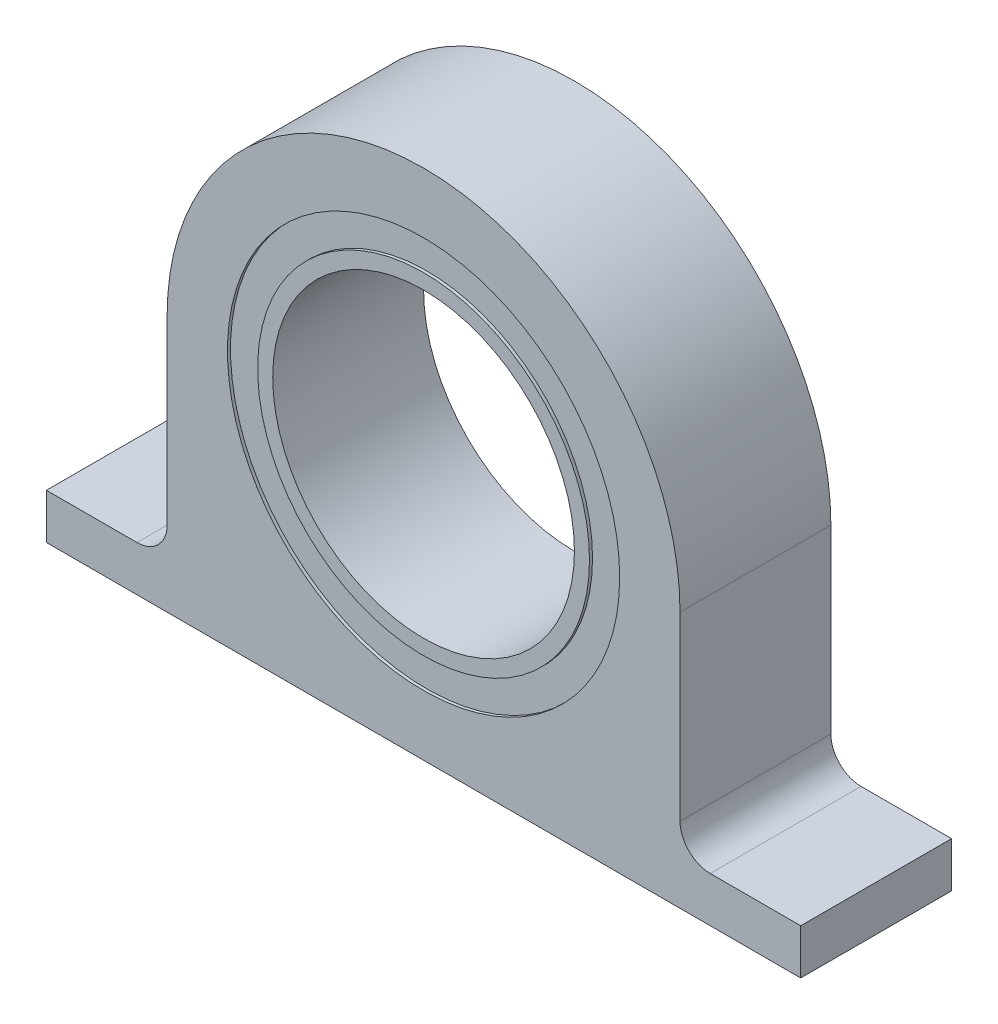
ISO-10303-21;
HEADER;
FILE_DESCRIPTION(('STEP AP214'),'2;1');
FILE_NAME('part.step','',(''),(''),'','','');
FILE_SCHEMA(('AUTOMOTIVE_DESIGN { 1 0 10303 214 1 1 1 1 }'));
ENDSEC;
DATA;
#1=APPLICATION_CONTEXT('core data for automotive mechanical design processes');
#2=APPLICATION_PROTOCOL_DEFINITION('international standard','automotive_design',2000,#1);
#3=PRODUCT_CONTEXT('',#1,'mechanical');
#4=PRODUCT('Part','Part','',(#3));
#5=PRODUCT_RELATED_PRODUCT_CATEGORY('part','',(#4));
#6=PRODUCT_DEFINITION_FORMATION('','',#4);
#7=PRODUCT_DEFINITION_CONTEXT('part definition',#1,'design');
#8=PRODUCT_DEFINITION('design','',#6,#7);
#9=PRODUCT_DEFINITION_SHAPE('','',#8);
#10=(LENGTH_UNIT() NAMED_UNIT(*) SI_UNIT(.MILLI.,.METRE.));
#11=(NAMED_UNIT(*) PLANE_ANGLE_UNIT() SI_UNIT($,.RADIAN.));
#12=(NAMED_UNIT(*) SI_UNIT($,.STERADIAN.) SOLID_ANGLE_UNIT());
#13=UNCERTAINTY_MEASURE_WITH_UNIT(LENGTH_MEASURE(1.E-05),#10,'distance_accuracy_value','');
#14=(GEOMETRIC_REPRESENTATION_CONTEXT(3) GLOBAL_UNCERTAINTY_ASSIGNED_CONTEXT((#13)) GLOBAL_UNIT_ASSIGNED_CONTEXT((#10,
#11,#12)) REPRESENTATION_CONTEXT('',''));
#15=CARTESIAN_POINT('',(0.,0.,0.));
#16=DIRECTION('',(0.,0.,1.));
#17=DIRECTION('',(1.,0.,0.));
#18=AXIS2_PLACEMENT_3D('',#15,#16,#17);
#19=CARTESIAN_POINT('',(0.,0.,0.));
#20=DIRECTION('',(0.,0.,1.));
#21=DIRECTION('',(1.,0.,0.));
#22=AXIS2_PLACEMENT_3D('',#19,#20,#21);
#23=PLANE('',#22);
#24=CARTESIAN_POINT('',(0.,0.,0.));
#25=DIRECTION('',(0.,0.,1.));
#26=DIRECTION('',(1.,0.,0.));
#27=AXIS2_PLACEMENT_3D('',#24,#25,#26);
#28=CIRCLE('',#27,12.7);
#29=CARTESIAN_POINT('',(12.7,0.,0.));
#30=VERTEX_POINT('',#29);
#31=EDGE_CURVE('E39',#30,#30,#28,.T.);
#32=ORIENTED_EDGE('',*,*,#31,.T.);
#33=EDGE_LOOP('',(#32));
#34=FACE_BOUND('',#33,.T.);
#35=CARTESIAN_POINT('',(0.,0.,0.));
#36=DIRECTION('',(0.,0.,1.));
#37=DIRECTION('',(1.,0.,0.));
#38=AXIS2_PLACEMENT_3D('',#35,#36,#37);
#39=CIRCLE('',#38,13.97);
#40=CARTESIAN_POINT('',(13.97,0.,0.));
#41=VERTEX_POINT('',#40);
#42=EDGE_CURVE('E196',#41,#41,#39,.T.);
#43=ORIENTED_EDGE('',*,*,#42,.F.);
#44=EDGE_LOOP('',(#43));
#45=FACE_BOUND('',#44,.T.);
#46=ADVANCED_FACE('F35',(#34,#45),#23,.F.);
#47=CARTESIAN_POINT('',(0.,0.,12.7));
#48=DIRECTION('',(0.,0.,1.));
#49=DIRECTION('',(1.,0.,0.));
#50=AXIS2_PLACEMENT_3D('',#47,#48,#49);
#51=PLANE('',#50);
#52=CARTESIAN_POINT('',(0.,0.,12.7));
#53=DIRECTION('',(0.,0.,1.));
#54=DIRECTION('',(1.,0.,0.));
#55=AXIS2_PLACEMENT_3D('',#52,#53,#54);
#56=CIRCLE('',#55,12.7);
#57=CARTESIAN_POINT('',(12.7,0.,12.7));
#58=VERTEX_POINT('',#57);
#59=EDGE_CURVE('E11',#58,#58,#56,.T.);
#60=ORIENTED_EDGE('',*,*,#59,.F.);
#61=EDGE_LOOP('',(#60));
#62=FACE_BOUND('',#61,.T.);
#63=CARTESIAN_POINT('',(0.,0.,12.7));
#64=DIRECTION('',(0.,0.,1.));
#65=DIRECTION('',(1.,0.,0.));
#66=AXIS2_PLACEMENT_3D('',#63,#64,#65);
#67=CIRCLE('',#66,13.97);
#68=CARTESIAN_POINT('',(13.97,0.,12.7));
#69=VERTEX_POINT('',#68);
#70=EDGE_CURVE('E204',#69,#69,#67,.T.);
#71=ORIENTED_EDGE('',*,*,#70,.T.);
#72=EDGE_LOOP('',(#71));
#73=FACE_BOUND('',#72,.T.);
#74=ADVANCED_FACE('F224',(#62,#73),#51,.T.);
#75=CARTESIAN_POINT('',(0.,0.,12.7));
#76=DIRECTION('',(0.,0.,1.));
#77=DIRECTION('',(1.,0.,0.));
#78=AXIS2_PLACEMENT_3D('',#75,#76,#77);
#79=CIRCLE('',#78,16.51);
#80=CARTESIAN_POINT('',(16.51,0.,12.7));
#81=VERTEX_POINT('',#80);
#82=EDGE_CURVE('E213',#81,#81,#79,.T.);
#83=ORIENTED_EDGE('',*,*,#82,.F.);
#84=EDGE_LOOP('',(#83));
#85=FACE_BOUND('',#84,.T.);
#86=DIRECTION('',(-1.,0.,0.));
#87=VECTOR('',#86,1.);
#88=CARTESIAN_POINT('',(-31.75,-17.78,12.7));
#89=LINE('',#88,#87);
#90=CARTESIAN_POINT('',(-24.13,-17.78,12.7));
#91=VERTEX_POINT('',#90);
#92=CARTESIAN_POINT('',(-31.75,-17.78,12.7));
#93=VERTEX_POINT('',#92);
#94=EDGE_CURVE('E116',#91,#93,#89,.T.);
#95=ORIENTED_EDGE('',*,*,#94,.T.);
#96=DIRECTION('',(0.,-1.,0.));
#97=VECTOR('',#96,1.);
#98=CARTESIAN_POINT('',(-31.75,-17.78,12.7));
#99=LINE('',#98,#97);
#100=CARTESIAN_POINT('',(-31.75,-21.59,12.7));
#101=VERTEX_POINT('',#100);
#102=EDGE_CURVE('E125',#93,#101,#99,.T.);
#103=ORIENTED_EDGE('',*,*,#102,.T.);
#104=DIRECTION('',(1.,0.,0.));
#105=VECTOR('',#104,1.);
#106=CARTESIAN_POINT('',(-31.75,-21.59,12.7));
#107=LINE('',#106,#105);
#108=CARTESIAN_POINT('',(31.75,-21.59,12.7));
#109=VERTEX_POINT('',#108);
#110=EDGE_CURVE('E58',#101,#109,#107,.T.);
#111=ORIENTED_EDGE('',*,*,#110,.T.);
#112=DIRECTION('',(0.,1.,0.));
#113=VECTOR('',#112,1.);
#114=CARTESIAN_POINT('',(31.75,-17.78,12.7));
#115=LINE('',#114,#113);
#116=CARTESIAN_POINT('',(31.75,-17.78,12.7));
#117=VERTEX_POINT('',#116);
#118=EDGE_CURVE('E151',#109,#117,#115,.T.);
#119=ORIENTED_EDGE('',*,*,#118,.T.);
#120=DIRECTION('',(-1.,0.,0.));
#121=VECTOR('',#120,1.);
#122=CARTESIAN_POINT('',(24.13,-17.78,12.7));
#123=LINE('',#122,#121);
#124=CARTESIAN_POINT('',(24.13,-17.78,12.7));
#125=VERTEX_POINT('',#124);
#126=EDGE_CURVE('E148',#117,#125,#123,.T.);
#127=ORIENTED_EDGE('',*,*,#126,.T.);
#128=CARTESIAN_POINT('',(24.13,-15.24,12.7));
#129=DIRECTION('',(0.,0.,1.));
#130=DIRECTION('',(1.,0.,0.));
#131=AXIS2_PLACEMENT_3D('',#128,#129,#130);
#132=CIRCLE('',#131,2.54);
#133=CARTESIAN_POINT('',(21.59,-15.24,12.7));
#134=VERTEX_POINT('',#133);
#135=EDGE_CURVE('E145',#125,#134,#132,.F.);
#136=ORIENTED_EDGE('',*,*,#135,.T.);
#137=DIRECTION('',(0.,1.,0.));
#138=VECTOR('',#137,1.);
#139=CARTESIAN_POINT('',(21.59,-15.24,12.7));
#140=LINE('',#139,#138);
#141=CARTESIAN_POINT('',(21.59,0.,12.7));
#142=VERTEX_POINT('',#141);
#143=EDGE_CURVE('E142',#134,#142,#140,.T.);
#144=ORIENTED_EDGE('',*,*,#143,.T.);
#145=CARTESIAN_POINT('',(0.,0.,12.7));
#146=DIRECTION('',(0.,0.,1.));
#147=DIRECTION('',(1.,0.,0.));
#148=AXIS2_PLACEMENT_3D('',#145,#146,#147);
#149=CIRCLE('',#148,21.59);
#150=CARTESIAN_POINT('',(-21.59,0.,12.7));
#151=VERTEX_POINT('',#150);
#152=EDGE_CURVE('E139',#142,#151,#149,.T.);
#153=ORIENTED_EDGE('',*,*,#152,.T.);
#154=DIRECTION('',(0.,-1.,0.));
#155=VECTOR('',#154,1.);
#156=CARTESIAN_POINT('',(-21.59,0.,12.7));
#157=LINE('',#156,#155);
#158=CARTESIAN_POINT('',(-21.59,-15.24,12.7));
#159=VERTEX_POINT('',#158);
#160=EDGE_CURVE('E135',#151,#159,#157,.T.);
#161=ORIENTED_EDGE('',*,*,#160,.T.);
#162=CARTESIAN_POINT('',(-24.13,-15.24,12.7));
#163=DIRECTION('',(0.,0.,1.));
#164=DIRECTION('',(1.,0.,0.));
#165=AXIS2_PLACEMENT_3D('',#162,#163,#164);
#166=CIRCLE('',#165,2.54);
#167=EDGE_CURVE('E133',#159,#91,#166,.F.);
#168=ORIENTED_EDGE('',*,*,#167,.T.);
#169=EDGE_LOOP('',(#95,#103,#111,#119,#127,#136,#144,#153,#161,#168));
#170=FACE_BOUND('',#169,.T.);
#171=ADVANCED_FACE('F131',(#85,#170),#51,.T.);
#172=CARTESIAN_POINT('',(0.,0.,0.));
#173=DIRECTION('',(0.,0.,1.));
#174=DIRECTION('',(1.,0.,0.));
#175=AXIS2_PLACEMENT_3D('',#172,#173,#174);
#176=CIRCLE('',#175,16.51);
#177=CARTESIAN_POINT('',(16.51,0.,0.));
#178=VERTEX_POINT('',#177);
#179=EDGE_CURVE('E201',#178,#178,#176,.T.);
#180=ORIENTED_EDGE('',*,*,#179,.T.);
#181=EDGE_LOOP('',(#180));
#182=FACE_BOUND('',#181,.T.);
#183=DIRECTION('',(0.,-1.,0.));
#184=VECTOR('',#183,1.);
#185=CARTESIAN_POINT('',(-31.75,-17.78,0.));
#186=LINE('',#185,#184);
#187=CARTESIAN_POINT('',(-31.75,-17.78,0.));
#188=VERTEX_POINT('',#187);
#189=CARTESIAN_POINT('',(-31.75,-21.59,0.));
#190=VERTEX_POINT('',#189);
#191=EDGE_CURVE('E129',#188,#190,#186,.T.);
#192=ORIENTED_EDGE('',*,*,#191,.F.);
#193=DIRECTION('',(-1.,0.,0.));
#194=VECTOR('',#193,1.);
#195=CARTESIAN_POINT('',(-31.75,-17.78,0.));
#196=LINE('',#195,#194);
#197=CARTESIAN_POINT('',(-24.13,-17.78,0.));
#198=VERTEX_POINT('',#197);
#199=EDGE_CURVE('E119',#198,#188,#196,.T.);
#200=ORIENTED_EDGE('',*,*,#199,.F.);
#201=CARTESIAN_POINT('',(-24.13,-15.24,0.));
#202=DIRECTION('',(0.,0.,-1.));
#203=DIRECTION('',(1.,0.,0.));
#204=AXIS2_PLACEMENT_3D('',#201,#202,#203);
#205=CIRCLE('',#204,2.54);
#206=CARTESIAN_POINT('',(-21.59,-15.24,0.));
#207=VERTEX_POINT('',#206);
#208=EDGE_CURVE('E177',#207,#198,#205,.T.);
#209=ORIENTED_EDGE('',*,*,#208,.F.);
#210=DIRECTION('',(0.,-1.,0.));
#211=VECTOR('',#210,1.);
#212=CARTESIAN_POINT('',(-21.59,0.,0.));
#213=LINE('',#212,#211);
#214=CARTESIAN_POINT('',(-21.59,0.,0.));
#215=VERTEX_POINT('',#214);
#216=EDGE_CURVE('E174',#215,#207,#213,.T.);
#217=ORIENTED_EDGE('',*,*,#216,.F.);
#218=CARTESIAN_POINT('',(0.,0.,0.));
#219=DIRECTION('',(0.,0.,1.));
#220=DIRECTION('',(-1.,0.,0.));
#221=AXIS2_PLACEMENT_3D('',#218,#219,#220);
#222=CIRCLE('',#221,21.59);
#223=CARTESIAN_POINT('',(21.59,0.,0.));
#224=VERTEX_POINT('',#223);
#225=EDGE_CURVE('E171',#224,#215,#222,.T.);
#226=ORIENTED_EDGE('',*,*,#225,.F.);
#227=DIRECTION('',(0.,1.,0.));
#228=VECTOR('',#227,1.);
#229=CARTESIAN_POINT('',(21.59,-15.24,0.));
#230=LINE('',#229,#228);
#231=CARTESIAN_POINT('',(21.59,-15.24,0.));
#232=VERTEX_POINT('',#231);
#233=EDGE_CURVE('E168',#232,#224,#230,.T.);
#234=ORIENTED_EDGE('',*,*,#233,.F.);
#235=CARTESIAN_POINT('',(24.13,-15.24,0.));
#236=DIRECTION('',(0.,0.,-1.));
#237=DIRECTION('',(1.,0.,0.));
#238=AXIS2_PLACEMENT_3D('',#235,#236,#237);
#239=CIRCLE('',#238,2.54);
#240=CARTESIAN_POINT('',(24.13,-17.78,0.));
#241=VERTEX_POINT('',#240);
#242=EDGE_CURVE('E165',#241,#232,#239,.T.);
#243=ORIENTED_EDGE('',*,*,#242,.F.);
#244=DIRECTION('',(-1.,0.,0.));
#245=VECTOR('',#244,1.);
#246=CARTESIAN_POINT('',(24.13,-17.78,0.));
#247=LINE('',#246,#245);
#248=CARTESIAN_POINT('',(31.75,-17.78,0.));
#249=VERTEX_POINT('',#248);
#250=EDGE_CURVE('E162',#249,#241,#247,.T.);
#251=ORIENTED_EDGE('',*,*,#250,.F.);
#252=DIRECTION('',(0.,1.,0.));
#253=VECTOR('',#252,1.);
#254=CARTESIAN_POINT('',(31.75,-17.78,0.));
#255=LINE('',#254,#253);
#256=CARTESIAN_POINT('',(31.75,-21.59,0.));
#257=VERTEX_POINT('',#256);
#258=EDGE_CURVE('E159',#257,#249,#255,.T.);
#259=ORIENTED_EDGE('',*,*,#258,.F.);
#260=DIRECTION('',(1.,0.,0.));
#261=VECTOR('',#260,1.);
#262=CARTESIAN_POINT('',(-31.75,-21.59,0.));
#263=LINE('',#262,#261);
#264=EDGE_CURVE('E156',#190,#257,#263,.T.);
#265=ORIENTED_EDGE('',*,*,#264,.F.);
#266=EDGE_LOOP('',(#192,#200,#209,#217,#226,#234,#243,#251,#259,#265));
#267=FACE_BOUND('',#266,.T.);
#268=ADVANCED_FACE('F37',(#182,#267),#23,.F.);
#269=CARTESIAN_POINT('',(0.,0.,12.7));
#270=DIRECTION('',(0.,0.,-1.));
#271=DIRECTION('',(-1.,0.,0.));
#272=AXIS2_PLACEMENT_3D('',#269,#270,#271);
#273=CYLINDRICAL_SURFACE('',#272,12.7);
#274=ORIENTED_EDGE('',*,*,#59,.T.);
#275=EDGE_LOOP('',(#274));
#276=FACE_BOUND('',#275,.T.);
#277=ORIENTED_EDGE('',*,*,#31,.F.);
#278=EDGE_LOOP('',(#277));
#279=FACE_BOUND('',#278,.T.);
#280=ADVANCED_FACE('F229',(#276,#279),#273,.F.);
#281=CARTESIAN_POINT('',(0.,0.,12.446));
#282=DIRECTION('',(0.,0.,1.));
#283=DIRECTION('',(1.,0.,0.));
#284=AXIS2_PLACEMENT_3D('',#281,#282,#283);
#285=CYLINDRICAL_SURFACE('',#284,13.97);
#286=CARTESIAN_POINT('',(0.,0.,12.446));
#287=DIRECTION('',(0.,0.,1.));
#288=DIRECTION('',(1.,0.,0.));
#289=AXIS2_PLACEMENT_3D('',#286,#287,#288);
#290=CIRCLE('',#289,13.97);
#291=CARTESIAN_POINT('',(13.97,0.,12.446));
#292=VERTEX_POINT('',#291);
#293=EDGE_CURVE('E209',#292,#292,#290,.T.);
#294=ORIENTED_EDGE('',*,*,#293,.T.);
#295=EDGE_LOOP('',(#294));
#296=FACE_BOUND('',#295,.T.);
#297=ORIENTED_EDGE('',*,*,#70,.F.);
#298=EDGE_LOOP('',(#297));
#299=FACE_BOUND('',#298,.T.);
#300=ADVANCED_FACE('F262',(#296,#299),#285,.T.);
#301=CARTESIAN_POINT('',(0.,0.,12.446));
#302=DIRECTION('',(0.,0.,1.));
#303=DIRECTION('',(1.,0.,0.));
#304=AXIS2_PLACEMENT_3D('',#301,#302,#303);
#305=CYLINDRICAL_SURFACE('',#304,16.51);
#306=CARTESIAN_POINT('',(0.,0.,12.446));
#307=DIRECTION('',(0.,0.,1.));
#308=DIRECTION('',(1.,0.,0.));
#309=AXIS2_PLACEMENT_3D('',#306,#307,#308);
#310=CIRCLE('',#309,16.51);
#311=CARTESIAN_POINT('',(16.51,0.,12.446));
#312=VERTEX_POINT('',#311);
#313=EDGE_CURVE('E212',#312,#312,#310,.T.);
#314=ORIENTED_EDGE('',*,*,#313,.F.);
#315=EDGE_LOOP('',(#314));
#316=FACE_BOUND('',#315,.T.);
#317=ORIENTED_EDGE('',*,*,#82,.T.);
#318=EDGE_LOOP('',(#317));
#319=FACE_BOUND('',#318,.T.);
#320=ADVANCED_FACE('F221',(#316,#319),#305,.F.);
#321=CARTESIAN_POINT('',(0.,0.,12.446));
#322=DIRECTION('',(0.,0.,1.));
#323=DIRECTION('',(1.,0.,0.));
#324=AXIS2_PLACEMENT_3D('',#321,#322,#323);
#325=PLANE('',#324);
#326=ORIENTED_EDGE('',*,*,#293,.F.);
#327=EDGE_LOOP('',(#326));
#328=FACE_BOUND('',#327,.T.);
#329=ORIENTED_EDGE('',*,*,#313,.T.);
#330=EDGE_LOOP('',(#329));
#331=FACE_BOUND('',#330,.T.);
#332=ADVANCED_FACE('F245',(#328,#331),#325,.T.);
#333=CARTESIAN_POINT('',(0.,0.,0.254));
#334=DIRECTION('',(0.,0.,-1.));
#335=DIRECTION('',(-1.,0.,0.));
#336=AXIS2_PLACEMENT_3D('',#333,#334,#335);
#337=CYLINDRICAL_SURFACE('',#336,13.97);
#338=CARTESIAN_POINT('',(0.,0.,0.254));
#339=DIRECTION('',(0.,0.,1.));
#340=DIRECTION('',(1.,0.,0.));
#341=AXIS2_PLACEMENT_3D('',#338,#339,#340);
#342=CIRCLE('',#341,13.97);
#343=CARTESIAN_POINT('',(13.97,0.,0.254));
#344=VERTEX_POINT('',#343);
#345=EDGE_CURVE('E197',#344,#344,#342,.T.);
#346=ORIENTED_EDGE('',*,*,#345,.F.);
#347=EDGE_LOOP('',(#346));
#348=FACE_BOUND('',#347,.T.);
#349=ORIENTED_EDGE('',*,*,#42,.T.);
#350=EDGE_LOOP('',(#349));
#351=FACE_BOUND('',#350,.T.);
#352=ADVANCED_FACE('F242',(#348,#351),#337,.T.);
#353=CARTESIAN_POINT('',(0.,0.,0.254));
#354=DIRECTION('',(0.,0.,-1.));
#355=DIRECTION('',(-1.,0.,0.));
#356=AXIS2_PLACEMENT_3D('',#353,#354,#355);
#357=CYLINDRICAL_SURFACE('',#356,16.51);
#358=CARTESIAN_POINT('',(0.,0.,0.254));
#359=DIRECTION('',(0.,0.,1.));
#360=DIRECTION('',(1.,0.,0.));
#361=AXIS2_PLACEMENT_3D('',#358,#359,#360);
#362=CIRCLE('',#361,16.51);
#363=CARTESIAN_POINT('',(16.51,0.,0.254));
#364=VERTEX_POINT('',#363);
#365=EDGE_CURVE('E200',#364,#364,#362,.T.);
#366=ORIENTED_EDGE('',*,*,#365,.T.);
#367=EDGE_LOOP('',(#366));
#368=FACE_BOUND('',#367,.T.);
#369=ORIENTED_EDGE('',*,*,#179,.F.);
#370=EDGE_LOOP('',(#369));
#371=FACE_BOUND('',#370,.T.);
#372=ADVANCED_FACE('F244',(#368,#371),#357,.F.);
#373=CARTESIAN_POINT('',(0.,0.,0.254));
#374=DIRECTION('',(0.,0.,-1.));
#375=DIRECTION('',(1.,0.,0.));
#376=AXIS2_PLACEMENT_3D('',#373,#374,#375);
#377=PLANE('',#376);
#378=ORIENTED_EDGE('',*,*,#345,.T.);
#379=EDGE_LOOP('',(#378));
#380=FACE_BOUND('',#379,.T.);
#381=ORIENTED_EDGE('',*,*,#365,.F.);
#382=EDGE_LOOP('',(#381));
#383=FACE_BOUND('',#382,.T.);
#384=ADVANCED_FACE('F252',(#380,#383),#377,.T.);
#385=CARTESIAN_POINT('',(-31.75,-17.78,89.4903796057814));
#386=DIRECTION('',(0.,-1.,0.));
#387=DIRECTION('',(0.,0.,-1.));
#388=AXIS2_PLACEMENT_3D('',#385,#386,#387);
#389=PLANE('',#388);
#390=ORIENTED_EDGE('',*,*,#94,.F.);
#391=DIRECTION('',(0.,0.,-1.));
#392=VECTOR('',#391,1.);
#393=CARTESIAN_POINT('',(-24.13,-17.78,89.4903796057814));
#394=LINE('',#393,#392);
#395=EDGE_CURVE('E50',#91,#198,#394,.T.);
#396=ORIENTED_EDGE('',*,*,#395,.T.);
#397=ORIENTED_EDGE('',*,*,#199,.T.);
#398=DIRECTION('',(0.,0.,-1.));
#399=VECTOR('',#398,1.);
#400=CARTESIAN_POINT('',(-31.75,-17.78,89.4903796057814));
#401=LINE('',#400,#399);
#402=EDGE_CURVE('E112',#93,#188,#401,.T.);
#403=ORIENTED_EDGE('',*,*,#402,.F.);
#404=EDGE_LOOP('',(#390,#396,#397,#403));
#405=FACE_BOUND('',#404,.T.);
#406=ADVANCED_FACE('F114',(#405),#389,.F.);
#407=CARTESIAN_POINT('',(-24.13,-15.24,89.4903796057814));
#408=DIRECTION('',(0.,0.,-1.));
#409=DIRECTION('',(-1.,0.,0.));
#410=AXIS2_PLACEMENT_3D('',#407,#408,#409);
#411=CYLINDRICAL_SURFACE('',#410,2.54);
#412=ORIENTED_EDGE('',*,*,#167,.F.);
#413=DIRECTION('',(0.,0.,-1.));
#414=VECTOR('',#413,1.);
#415=CARTESIAN_POINT('',(-21.59,-15.24,89.4903796057814));
#416=LINE('',#415,#414);
#417=EDGE_CURVE('E181',#159,#207,#416,.T.);
#418=ORIENTED_EDGE('',*,*,#417,.T.);
#419=ORIENTED_EDGE('',*,*,#208,.T.);
#420=ORIENTED_EDGE('',*,*,#395,.F.);
#421=EDGE_LOOP('',(#412,#418,#419,#420));
#422=FACE_BOUND('',#421,.T.);
#423=ADVANCED_FACE('F308',(#422),#411,.F.);
#424=CARTESIAN_POINT('',(-21.59,0.,89.4903796057814));
#425=DIRECTION('',(1.,0.,0.));
#426=DIRECTION('',(0.,0.,-1.));
#427=AXIS2_PLACEMENT_3D('',#424,#425,#426);
#428=PLANE('',#427);
#429=ORIENTED_EDGE('',*,*,#160,.F.);
#430=DIRECTION('',(0.,0.,-1.));
#431=VECTOR('',#430,1.);
#432=CARTESIAN_POINT('',(-21.59,0.,89.4903796057814));
#433=LINE('',#432,#431);
#434=EDGE_CURVE('E183',#151,#215,#433,.T.);
#435=ORIENTED_EDGE('',*,*,#434,.T.);
#436=ORIENTED_EDGE('',*,*,#216,.T.);
#437=ORIENTED_EDGE('',*,*,#417,.F.);
#438=EDGE_LOOP('',(#429,#435,#436,#437));
#439=FACE_BOUND('',#438,.T.);
#440=ADVANCED_FACE('F315',(#439),#428,.F.);
#441=CARTESIAN_POINT('',(0.,0.,89.4903796057814));
#442=DIRECTION('',(0.,0.,-1.));
#443=DIRECTION('',(-1.,0.,0.));
#444=AXIS2_PLACEMENT_3D('',#441,#442,#443);
#445=CYLINDRICAL_SURFACE('',#444,21.59);
#446=ORIENTED_EDGE('',*,*,#152,.F.);
#447=DIRECTION('',(0.,0.,-1.));
#448=VECTOR('',#447,1.);
#449=CARTESIAN_POINT('',(21.59,0.,89.4903796057814));
#450=LINE('',#449,#448);
#451=EDGE_CURVE('E185',#142,#224,#450,.T.);
#452=ORIENTED_EDGE('',*,*,#451,.T.);
#453=ORIENTED_EDGE('',*,*,#225,.T.);
#454=ORIENTED_EDGE('',*,*,#434,.F.);
#455=EDGE_LOOP('',(#446,#452,#453,#454));
#456=FACE_BOUND('',#455,.T.);
#457=ADVANCED_FACE('F322',(#456),#445,.T.);
#458=CARTESIAN_POINT('',(21.59,-15.24,89.4903796057814));
#459=DIRECTION('',(-1.,0.,0.));
#460=DIRECTION('',(0.,0.,1.));
#461=AXIS2_PLACEMENT_3D('',#458,#459,#460);
#462=PLANE('',#461);
#463=ORIENTED_EDGE('',*,*,#143,.F.);
#464=DIRECTION('',(0.,0.,-1.));
#465=VECTOR('',#464,1.);
#466=CARTESIAN_POINT('',(21.59,-15.24,89.4903796057814));
#467=LINE('',#466,#465);
#468=EDGE_CURVE('E187',#134,#232,#467,.T.);
#469=ORIENTED_EDGE('',*,*,#468,.T.);
#470=ORIENTED_EDGE('',*,*,#233,.T.);
#471=ORIENTED_EDGE('',*,*,#451,.F.);
#472=EDGE_LOOP('',(#463,#469,#470,#471));
#473=FACE_BOUND('',#472,.T.);
#474=ADVANCED_FACE('F330',(#473),#462,.F.);
#475=CARTESIAN_POINT('',(24.13,-15.24,89.4903796057814));
#476=DIRECTION('',(0.,0.,-1.));
#477=DIRECTION('',(-1.,0.,0.));
#478=AXIS2_PLACEMENT_3D('',#475,#476,#477);
#479=CYLINDRICAL_SURFACE('',#478,2.54);
#480=ORIENTED_EDGE('',*,*,#135,.F.);
#481=DIRECTION('',(0.,0.,-1.));
#482=VECTOR('',#481,1.);
#483=CARTESIAN_POINT('',(24.13,-17.78,89.4903796057814));
#484=LINE('',#483,#482);
#485=EDGE_CURVE('E189',#125,#241,#484,.T.);
#486=ORIENTED_EDGE('',*,*,#485,.T.);
#487=ORIENTED_EDGE('',*,*,#242,.T.);
#488=ORIENTED_EDGE('',*,*,#468,.F.);
#489=EDGE_LOOP('',(#480,#486,#487,#488));
#490=FACE_BOUND('',#489,.T.);
#491=ADVANCED_FACE('F338',(#490),#479,.F.);
#492=CARTESIAN_POINT('',(24.13,-17.78,89.4903796057814));
#493=DIRECTION('',(0.,-1.,0.));
#494=DIRECTION('',(1.,0.,0.));
#495=AXIS2_PLACEMENT_3D('',#492,#493,#494);
#496=PLANE('',#495);
#497=ORIENTED_EDGE('',*,*,#126,.F.);
#498=DIRECTION('',(0.,0.,-1.));
#499=VECTOR('',#498,1.);
#500=CARTESIAN_POINT('',(31.75,-17.78,89.4903796057814));
#501=LINE('',#500,#499);
#502=EDGE_CURVE('E191',#117,#249,#501,.T.);
#503=ORIENTED_EDGE('',*,*,#502,.T.);
#504=ORIENTED_EDGE('',*,*,#250,.T.);
#505=ORIENTED_EDGE('',*,*,#485,.F.);
#506=EDGE_LOOP('',(#497,#503,#504,#505));
#507=FACE_BOUND('',#506,.T.);
#508=ADVANCED_FACE('F346',(#507),#496,.F.);
#509=CARTESIAN_POINT('',(31.75,-17.78,89.4903796057814));
#510=DIRECTION('',(-1.,0.,0.));
#511=DIRECTION('',(0.,0.,1.));
#512=AXIS2_PLACEMENT_3D('',#509,#510,#511);
#513=PLANE('',#512);
#514=ORIENTED_EDGE('',*,*,#118,.F.);
#515=DIRECTION('',(0.,0.,-1.));
#516=VECTOR('',#515,1.);
#517=CARTESIAN_POINT('',(31.75,-21.59,89.4903796057814));
#518=LINE('',#517,#516);
#519=EDGE_CURVE('E193',#109,#257,#518,.T.);
#520=ORIENTED_EDGE('',*,*,#519,.T.);
#521=ORIENTED_EDGE('',*,*,#258,.T.);
#522=ORIENTED_EDGE('',*,*,#502,.F.);
#523=EDGE_LOOP('',(#514,#520,#521,#522));
#524=FACE_BOUND('',#523,.T.);
#525=ADVANCED_FACE('F354',(#524),#513,.F.);
#526=CARTESIAN_POINT('',(-31.75,-21.59,89.4903796057814));
#527=DIRECTION('',(0.,1.,0.));
#528=DIRECTION('',(-1.,0.,0.));
#529=AXIS2_PLACEMENT_3D('',#526,#527,#528);
#530=PLANE('',#529);
#531=ORIENTED_EDGE('',*,*,#110,.F.);
#532=DIRECTION('',(0.,0.,-1.));
#533=VECTOR('',#532,1.);
#534=CARTESIAN_POINT('',(-31.75,-21.59,89.4903796057814));
#535=LINE('',#534,#533);
#536=EDGE_CURVE('E127',#101,#190,#535,.T.);
#537=ORIENTED_EDGE('',*,*,#536,.T.);
#538=ORIENTED_EDGE('',*,*,#264,.T.);
#539=ORIENTED_EDGE('',*,*,#519,.F.);
#540=EDGE_LOOP('',(#531,#537,#538,#539));
#541=FACE_BOUND('',#540,.T.);
#542=ADVANCED_FACE('F362',(#541),#530,.F.);
#543=CARTESIAN_POINT('',(-31.75,-17.78,89.4903796057814));
#544=DIRECTION('',(1.,0.,0.));
#545=DIRECTION('',(0.,0.,-1.));
#546=AXIS2_PLACEMENT_3D('',#543,#544,#545);
#547=PLANE('',#546);
#548=ORIENTED_EDGE('',*,*,#102,.F.);
#549=ORIENTED_EDGE('',*,*,#402,.T.);
#550=ORIENTED_EDGE('',*,*,#191,.T.);
#551=ORIENTED_EDGE('',*,*,#536,.F.);
#552=EDGE_LOOP('',(#548,#549,#550,#551));
#553=FACE_BOUND('',#552,.T.);
#554=ADVANCED_FACE('F126',(#553),#547,.F.);
#555=CLOSED_SHELL('',(#46,#74,#171,#268,#280,#300,#320,#332,#352,#372,#384,#406,#423,#440,#457,
#474,#491,#508,#525,#542,#554));
#556=MANIFOLD_SOLID_BREP('B2',#555);
#557=ADVANCED_BREP_SHAPE_REPRESENTATION('',(#18,#556),#14);
#558=SHAPE_DEFINITION_REPRESENTATION(#9,#557);
ENDSEC;
END-ISO-10303-21;
